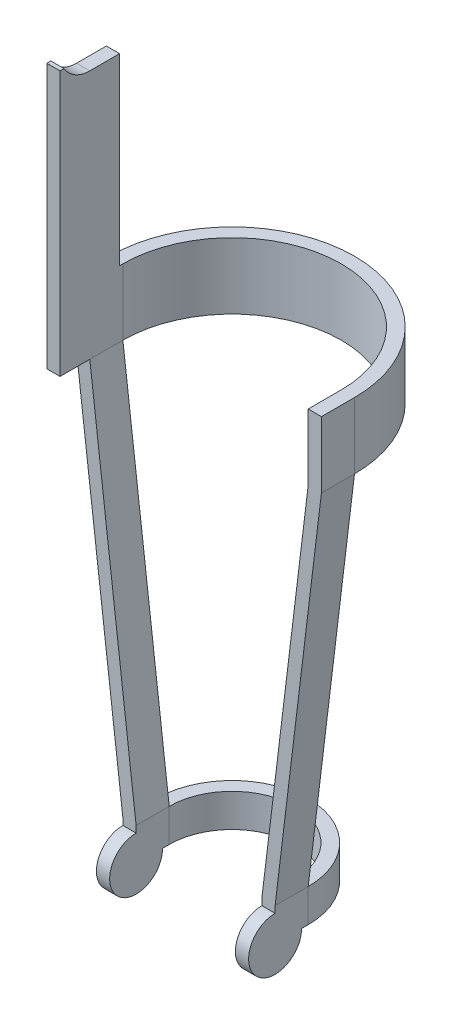
ISO-10303-21;
HEADER;
FILE_DESCRIPTION(('STEP AP214'),'2;1');
FILE_NAME('part.step','',(''),(''),'','','');
FILE_SCHEMA(('AUTOMOTIVE_DESIGN { 1 0 10303 214 1 1 1 1 }'));
ENDSEC;
DATA;
#1=APPLICATION_CONTEXT('core data for automotive mechanical design processes');
#2=APPLICATION_PROTOCOL_DEFINITION('international standard','automotive_design',2000,#1);
#3=PRODUCT_CONTEXT('',#1,'mechanical');
#4=PRODUCT('Part','Part','',(#3));
#5=PRODUCT_RELATED_PRODUCT_CATEGORY('part','',(#4));
#6=PRODUCT_DEFINITION_FORMATION('','',#4);
#7=PRODUCT_DEFINITION_CONTEXT('part definition',#1,'design');
#8=PRODUCT_DEFINITION('design','',#6,#7);
#9=PRODUCT_DEFINITION_SHAPE('','',#8);
#10=(LENGTH_UNIT() NAMED_UNIT(*) SI_UNIT(.MILLI.,.METRE.));
#11=(NAMED_UNIT(*) PLANE_ANGLE_UNIT() SI_UNIT($,.RADIAN.));
#12=(NAMED_UNIT(*) SI_UNIT($,.STERADIAN.) SOLID_ANGLE_UNIT());
#13=UNCERTAINTY_MEASURE_WITH_UNIT(LENGTH_MEASURE(1.E-05),#10,'distance_accuracy_value','');
#14=(GEOMETRIC_REPRESENTATION_CONTEXT(3) GLOBAL_UNCERTAINTY_ASSIGNED_CONTEXT((#13)) GLOBAL_UNIT_ASSIGNED_CONTEXT((#10,
#11,#12)) REPRESENTATION_CONTEXT('',''));
#15=CARTESIAN_POINT('',(0.,0.,0.));
#16=DIRECTION('',(0.,0.,1.));
#17=DIRECTION('',(1.,0.,0.));
#18=AXIS2_PLACEMENT_3D('',#15,#16,#17);
#19=CARTESIAN_POINT('',(-46.,20.,20.));
#20=DIRECTION('',(0.,0.,-1.));
#21=DIRECTION('',(-1.,0.,0.));
#22=AXIS2_PLACEMENT_3D('',#19,#20,#21);
#23=PLANE('',#22);
#24=DIRECTION('',(1.,0.,0.));
#25=VECTOR('',#24,1.);
#26=CARTESIAN_POINT('',(-46.,250.,20.));
#27=LINE('',#26,#25);
#28=CARTESIAN_POINT('',(-74.,250.,20.));
#29=VERTEX_POINT('',#28);
#30=CARTESIAN_POINT('',(-66.,250.,20.));
#31=VERTEX_POINT('',#30);
#32=EDGE_CURVE('E247',#29,#31,#27,.T.);
#33=ORIENTED_EDGE('',*,*,#32,.F.);
#34=DIRECTION('',(-0.120846923167835,0.992671154592933,0.));
#35=VECTOR('',#34,1.);
#36=CARTESIAN_POINT('',(-46.,20.,20.));
#37=LINE('',#36,#35);
#38=CARTESIAN_POINT('',(-46.,20.,20.));
#39=VERTEX_POINT('',#38);
#40=EDGE_CURVE('E371',#39,#29,#37,.T.);
#41=ORIENTED_EDGE('',*,*,#40,.F.);
#42=DIRECTION('',(0.,-1.,0.));
#43=VECTOR('',#42,1.);
#44=CARTESIAN_POINT('',(-46.,20.,20.));
#45=LINE('',#44,#43);
#46=CARTESIAN_POINT('',(-46.,16.,20.));
#47=VERTEX_POINT('',#46);
#48=EDGE_CURVE('E455',#39,#47,#45,.T.);
#49=ORIENTED_EDGE('',*,*,#48,.T.);
#50=DIRECTION('',(-1.,0.,0.));
#51=VECTOR('',#50,1.);
#52=CARTESIAN_POINT('',(-38.,16.,20.));
#53=LINE('',#52,#51);
#54=CARTESIAN_POINT('',(-38.,16.,20.));
#55=VERTEX_POINT('',#54);
#56=EDGE_CURVE('E451',#47,#55,#53,.F.);
#57=ORIENTED_EDGE('',*,*,#56,.T.);
#58=DIRECTION('',(0.,-1.,0.));
#59=VECTOR('',#58,1.);
#60=CARTESIAN_POINT('',(-38.,20.,20.));
#61=LINE('',#60,#59);
#62=CARTESIAN_POINT('',(-38.,20.,20.));
#63=VERTEX_POINT('',#62);
#64=EDGE_CURVE('E449',#63,#55,#61,.T.);
#65=ORIENTED_EDGE('',*,*,#64,.F.);
#66=DIRECTION('',(-0.120846923167835,0.992671154592933,0.));
#67=VECTOR('',#66,1.);
#68=CARTESIAN_POINT('',(-38.,20.,20.));
#69=LINE('',#68,#67);
#70=EDGE_CURVE('E348',#63,#31,#69,.T.);
#71=ORIENTED_EDGE('',*,*,#70,.T.);
#72=EDGE_LOOP('',(#33,#41,#49,#57,#65,#71));
#73=FACE_BOUND('',#72,.T.);
#74=ADVANCED_FACE('F40',(#73),#23,.F.);
#75=CARTESIAN_POINT('',(0.,20.,0.));
#76=DIRECTION('',(0.,-1.,0.));
#77=DIRECTION('',(0.,0.,-1.));
#78=AXIS2_PLACEMENT_3D('',#75,#76,#77);
#79=CYLINDRICAL_SURFACE('',#78,38.);
#80=CARTESIAN_POINT('',(0.,0.,0.));
#81=DIRECTION('',(0.,-1.,0.));
#82=DIRECTION('',(0.,0.,1.));
#83=AXIS2_PLACEMENT_3D('',#80,#81,#82);
#84=CIRCLE('',#83,38.);
#85=CARTESIAN_POINT('',(-38.,0.,0.));
#86=VERTEX_POINT('',#85);
#87=CARTESIAN_POINT('',(38.,0.,0.));
#88=VERTEX_POINT('',#87);
#89=EDGE_CURVE('E613',#86,#88,#84,.T.);
#90=ORIENTED_EDGE('',*,*,#89,.T.);
#91=DIRECTION('',(0.,-1.,0.));
#92=VECTOR('',#91,1.);
#93=CARTESIAN_POINT('',(38.,20.,0.));
#94=LINE('',#93,#92);
#95=CARTESIAN_POINT('',(38.,20.,0.));
#96=VERTEX_POINT('',#95);
#97=EDGE_CURVE('E482',#96,#88,#94,.T.);
#98=ORIENTED_EDGE('',*,*,#97,.F.);
#99=CARTESIAN_POINT('',(0.,20.,0.));
#100=DIRECTION('',(0.,-1.,0.));
#101=DIRECTION('',(0.,0.,1.));
#102=AXIS2_PLACEMENT_3D('',#99,#100,#101);
#103=CIRCLE('',#102,38.);
#104=CARTESIAN_POINT('',(-38.,20.,0.));
#105=VERTEX_POINT('',#104);
#106=EDGE_CURVE('E629',#105,#96,#103,.T.);
#107=ORIENTED_EDGE('',*,*,#106,.F.);
#108=DIRECTION('',(0.,-1.,0.));
#109=VECTOR('',#108,1.);
#110=CARTESIAN_POINT('',(-38.,20.,0.));
#111=LINE('',#110,#109);
#112=EDGE_CURVE('E456',#105,#86,#111,.T.);
#113=ORIENTED_EDGE('',*,*,#112,.T.);
#114=EDGE_LOOP('',(#90,#98,#107,#113));
#115=FACE_BOUND('',#114,.T.);
#116=ADVANCED_FACE('F42',(#115),#79,.F.);
#117=CARTESIAN_POINT('',(38.,20.,0.));
#118=DIRECTION('',(1.,0.,0.));
#119=DIRECTION('',(0.,0.,-1.));
#120=AXIS2_PLACEMENT_3D('',#117,#118,#119);
#121=PLANE('',#120);
#122=DIRECTION('',(0.,0.,1.));
#123=VECTOR('',#122,1.);
#124=CARTESIAN_POINT('',(38.,0.,0.));
#125=LINE('',#124,#123);
#126=CARTESIAN_POINT('',(38.,0.,4.));
#127=VERTEX_POINT('',#126);
#128=EDGE_CURVE('E606',#88,#127,#125,.T.);
#129=ORIENTED_EDGE('',*,*,#128,.T.);
#130=CARTESIAN_POINT('',(38.,0.,20.));
#131=DIRECTION('',(1.,0.,0.));
#132=DIRECTION('',(0.,0.,-1.));
#133=AXIS2_PLACEMENT_3D('',#130,#131,#132);
#134=CIRCLE('',#133,16.);
#135=CARTESIAN_POINT('',(38.,16.,20.));
#136=VERTEX_POINT('',#135);
#137=EDGE_CURVE('E313',#136,#127,#134,.T.);
#138=ORIENTED_EDGE('',*,*,#137,.F.);
#139=DIRECTION('',(0.,-1.,0.));
#140=VECTOR('',#139,1.);
#141=CARTESIAN_POINT('',(38.,20.,20.));
#142=LINE('',#141,#140);
#143=CARTESIAN_POINT('',(38.,20.,20.));
#144=VERTEX_POINT('',#143);
#145=EDGE_CURVE('E478',#144,#136,#142,.T.);
#146=ORIENTED_EDGE('',*,*,#145,.F.);
#147=DIRECTION('',(0.,0.,1.));
#148=VECTOR('',#147,1.);
#149=CARTESIAN_POINT('',(38.,20.,0.));
#150=LINE('',#149,#148);
#151=EDGE_CURVE('E634',#96,#144,#150,.T.);
#152=ORIENTED_EDGE('',*,*,#151,.F.);
#153=ORIENTED_EDGE('',*,*,#97,.T.);
#154=EDGE_LOOP('',(#129,#138,#146,#152,#153));
#155=FACE_BOUND('',#154,.T.);
#156=ADVANCED_FACE('F579',(#155),#121,.F.);
#157=CARTESIAN_POINT('',(46.,20.,20.));
#158=DIRECTION('',(0.,0.,-1.));
#159=DIRECTION('',(-1.,0.,0.));
#160=AXIS2_PLACEMENT_3D('',#157,#158,#159);
#161=PLANE('',#160);
#162=ORIENTED_EDGE('',*,*,#145,.T.);
#163=DIRECTION('',(1.,0.,0.));
#164=VECTOR('',#163,1.);
#165=CARTESIAN_POINT('',(38.,16.,20.));
#166=LINE('',#165,#164);
#167=CARTESIAN_POINT('',(46.,16.,20.));
#168=VERTEX_POINT('',#167);
#169=EDGE_CURVE('E668',#136,#168,#166,.T.);
#170=ORIENTED_EDGE('',*,*,#169,.T.);
#171=DIRECTION('',(0.,-1.,0.));
#172=VECTOR('',#171,1.);
#173=CARTESIAN_POINT('',(46.,20.,20.));
#174=LINE('',#173,#172);
#175=CARTESIAN_POINT('',(46.,20.,20.));
#176=VERTEX_POINT('',#175);
#177=EDGE_CURVE('E474',#176,#168,#174,.T.);
#178=ORIENTED_EDGE('',*,*,#177,.F.);
#179=DIRECTION('',(0.120846923167835,0.992671154592933,0.));
#180=VECTOR('',#179,1.);
#181=CARTESIAN_POINT('',(46.,20.,20.));
#182=LINE('',#181,#180);
#183=CARTESIAN_POINT('',(74.,250.,20.));
#184=VERTEX_POINT('',#183);
#185=EDGE_CURVE('E309',#176,#184,#182,.T.);
#186=ORIENTED_EDGE('',*,*,#185,.T.);
#187=DIRECTION('',(0.,1.,0.));
#188=VECTOR('',#187,1.);
#189=CARTESIAN_POINT('',(74.,250.,20.));
#190=LINE('',#189,#188);
#191=CARTESIAN_POINT('',(74.,290.,20.));
#192=VERTEX_POINT('',#191);
#193=EDGE_CURVE('E395',#184,#192,#190,.T.);
#194=ORIENTED_EDGE('',*,*,#193,.T.);
#195=DIRECTION('',(-1.,0.,0.));
#196=VECTOR('',#195,1.);
#197=CARTESIAN_POINT('',(74.,290.,20.));
#198=LINE('',#197,#196);
#199=CARTESIAN_POINT('',(66.,290.,20.));
#200=VERTEX_POINT('',#199);
#201=EDGE_CURVE('E401',#192,#200,#198,.T.);
#202=ORIENTED_EDGE('',*,*,#201,.T.);
#203=DIRECTION('',(0.,1.,0.));
#204=VECTOR('',#203,1.);
#205=CARTESIAN_POINT('',(66.,250.,20.));
#206=LINE('',#205,#204);
#207=CARTESIAN_POINT('',(66.,250.,20.));
#208=VERTEX_POINT('',#207);
#209=EDGE_CURVE('E406',#208,#200,#206,.T.);
#210=ORIENTED_EDGE('',*,*,#209,.F.);
#211=DIRECTION('',(0.120846923167835,0.992671154592933,0.));
#212=VECTOR('',#211,1.);
#213=CARTESIAN_POINT('',(38.,20.,20.));
#214=LINE('',#213,#212);
#215=EDGE_CURVE('E341',#144,#208,#214,.T.);
#216=ORIENTED_EDGE('',*,*,#215,.F.);
#217=EDGE_LOOP('',(#162,#170,#178,#186,#194,#202,#210,#216));
#218=FACE_BOUND('',#217,.T.);
#219=ADVANCED_FACE('F508',(#218),#161,.F.);
#220=CARTESIAN_POINT('',(46.,20.,0.));
#221=DIRECTION('',(-1.,0.,0.));
#222=DIRECTION('',(0.,0.,1.));
#223=AXIS2_PLACEMENT_3D('',#220,#221,#222);
#224=PLANE('',#223);
#225=ORIENTED_EDGE('',*,*,#177,.T.);
#226=CARTESIAN_POINT('',(46.,0.,20.));
#227=DIRECTION('',(1.,0.,0.));
#228=DIRECTION('',(0.,0.,-1.));
#229=AXIS2_PLACEMENT_3D('',#226,#227,#228);
#230=CIRCLE('',#229,16.);
#231=CARTESIAN_POINT('',(46.,0.,4.));
#232=VERTEX_POINT('',#231);
#233=EDGE_CURVE('E344',#168,#232,#230,.T.);
#234=ORIENTED_EDGE('',*,*,#233,.T.);
#235=DIRECTION('',(0.,0.,-1.));
#236=VECTOR('',#235,1.);
#237=CARTESIAN_POINT('',(46.,0.,0.));
#238=LINE('',#237,#236);
#239=CARTESIAN_POINT('',(46.,0.,0.));
#240=VERTEX_POINT('',#239);
#241=EDGE_CURVE('E612',#232,#240,#238,.T.);
#242=ORIENTED_EDGE('',*,*,#241,.T.);
#243=DIRECTION('',(0.,-1.,0.));
#244=VECTOR('',#243,1.);
#245=CARTESIAN_POINT('',(46.,20.,0.));
#246=LINE('',#245,#244);
#247=CARTESIAN_POINT('',(46.,20.,0.));
#248=VERTEX_POINT('',#247);
#249=EDGE_CURVE('E470',#248,#240,#246,.T.);
#250=ORIENTED_EDGE('',*,*,#249,.F.);
#251=DIRECTION('',(0.,0.,-1.));
#252=VECTOR('',#251,1.);
#253=CARTESIAN_POINT('',(46.,20.,0.));
#254=LINE('',#253,#252);
#255=EDGE_CURVE('E640',#176,#248,#254,.T.);
#256=ORIENTED_EDGE('',*,*,#255,.F.);
#257=EDGE_LOOP('',(#225,#234,#242,#250,#256));
#258=FACE_BOUND('',#257,.T.);
#259=ADVANCED_FACE('F592',(#258),#224,.F.);
#260=CARTESIAN_POINT('',(0.,20.,0.));
#261=DIRECTION('',(0.,-1.,0.));
#262=DIRECTION('',(0.,0.,-1.));
#263=AXIS2_PLACEMENT_3D('',#260,#261,#262);
#264=CYLINDRICAL_SURFACE('',#263,46.);
#265=CARTESIAN_POINT('',(0.,0.,0.));
#266=DIRECTION('',(0.,1.,0.));
#267=DIRECTION('',(0.,0.,1.));
#268=AXIS2_PLACEMENT_3D('',#265,#266,#267);
#269=CIRCLE('',#268,46.);
#270=CARTESIAN_POINT('',(-46.,0.,0.));
#271=VERTEX_POINT('',#270);
#272=EDGE_CURVE('E617',#240,#271,#269,.T.);
#273=ORIENTED_EDGE('',*,*,#272,.T.);
#274=DIRECTION('',(0.,-1.,0.));
#275=VECTOR('',#274,1.);
#276=CARTESIAN_POINT('',(-46.,20.,0.));
#277=LINE('',#276,#275);
#278=CARTESIAN_POINT('',(-46.,20.,0.));
#279=VERTEX_POINT('',#278);
#280=EDGE_CURVE('E460',#279,#271,#277,.T.);
#281=ORIENTED_EDGE('',*,*,#280,.F.);
#282=CARTESIAN_POINT('',(0.,20.,0.));
#283=DIRECTION('',(0.,1.,0.));
#284=DIRECTION('',(0.,0.,1.));
#285=AXIS2_PLACEMENT_3D('',#282,#283,#284);
#286=CIRCLE('',#285,46.);
#287=EDGE_CURVE('E648',#248,#279,#286,.T.);
#288=ORIENTED_EDGE('',*,*,#287,.F.);
#289=ORIENTED_EDGE('',*,*,#249,.T.);
#290=EDGE_LOOP('',(#273,#281,#288,#289));
#291=FACE_BOUND('',#290,.T.);
#292=ADVANCED_FACE('F588',(#291),#264,.T.);
#293=CARTESIAN_POINT('',(-46.,20.,0.));
#294=DIRECTION('',(1.,0.,0.));
#295=DIRECTION('',(0.,0.,-1.));
#296=AXIS2_PLACEMENT_3D('',#293,#294,#295);
#297=PLANE('',#296);
#298=DIRECTION('',(0.,0.,1.));
#299=VECTOR('',#298,1.);
#300=CARTESIAN_POINT('',(-46.,0.,0.));
#301=LINE('',#300,#299);
#302=CARTESIAN_POINT('',(-46.,0.,4.));
#303=VERTEX_POINT('',#302);
#304=EDGE_CURVE('E624',#271,#303,#301,.T.);
#305=ORIENTED_EDGE('',*,*,#304,.T.);
#306=CARTESIAN_POINT('',(-46.,0.,20.));
#307=DIRECTION('',(-1.,0.,0.));
#308=DIRECTION('',(0.,0.,1.));
#309=AXIS2_PLACEMENT_3D('',#306,#307,#308);
#310=CIRCLE('',#309,16.);
#311=EDGE_CURVE('E659',#303,#47,#310,.T.);
#312=ORIENTED_EDGE('',*,*,#311,.T.);
#313=ORIENTED_EDGE('',*,*,#48,.F.);
#314=DIRECTION('',(0.,0.,1.));
#315=VECTOR('',#314,1.);
#316=CARTESIAN_POINT('',(-46.,20.,0.));
#317=LINE('',#316,#315);
#318=EDGE_CURVE('E530',#279,#39,#317,.T.);
#319=ORIENTED_EDGE('',*,*,#318,.F.);
#320=ORIENTED_EDGE('',*,*,#280,.T.);
#321=EDGE_LOOP('',(#305,#312,#313,#319,#320));
#322=FACE_BOUND('',#321,.T.);
#323=ADVANCED_FACE('F585',(#322),#297,.F.);
#324=CARTESIAN_POINT('',(-38.,20.,0.));
#325=DIRECTION('',(-1.,0.,0.));
#326=DIRECTION('',(0.,0.,1.));
#327=AXIS2_PLACEMENT_3D('',#324,#325,#326);
#328=PLANE('',#327);
#329=ORIENTED_EDGE('',*,*,#64,.T.);
#330=CARTESIAN_POINT('',(-38.,0.,20.));
#331=DIRECTION('',(-1.,0.,0.));
#332=DIRECTION('',(0.,0.,1.));
#333=AXIS2_PLACEMENT_3D('',#330,#331,#332);
#334=CIRCLE('',#333,16.);
#335=CARTESIAN_POINT('',(-38.,0.,4.));
#336=VERTEX_POINT('',#335);
#337=EDGE_CURVE('E673',#336,#55,#334,.T.);
#338=ORIENTED_EDGE('',*,*,#337,.F.);
#339=DIRECTION('',(0.,0.,-1.));
#340=VECTOR('',#339,1.);
#341=CARTESIAN_POINT('',(-38.,0.,0.));
#342=LINE('',#341,#340);
#343=EDGE_CURVE('E627',#336,#86,#342,.T.);
#344=ORIENTED_EDGE('',*,*,#343,.T.);
#345=ORIENTED_EDGE('',*,*,#112,.F.);
#346=DIRECTION('',(0.,0.,-1.));
#347=VECTOR('',#346,1.);
#348=CARTESIAN_POINT('',(-38.,20.,0.));
#349=LINE('',#348,#347);
#350=EDGE_CURVE('E463',#63,#105,#349,.T.);
#351=ORIENTED_EDGE('',*,*,#350,.F.);
#352=EDGE_LOOP('',(#329,#338,#344,#345,#351));
#353=FACE_BOUND('',#352,.T.);
#354=ADVANCED_FACE('F583',(#353),#328,.F.);
#355=CARTESIAN_POINT('',(0.,20.,0.));
#356=DIRECTION('',(0.,1.,0.));
#357=DIRECTION('',(0.,0.,1.));
#358=AXIS2_PLACEMENT_3D('',#355,#356,#357);
#359=PLANE('',#358);
#360=DIRECTION('',(-1.,0.,0.));
#361=VECTOR('',#360,1.);
#362=CARTESIAN_POINT('',(-46.,20.,0.));
#363=LINE('',#362,#361);
#364=EDGE_CURVE('E353',#105,#279,#363,.T.);
#365=ORIENTED_EDGE('',*,*,#364,.F.);
#366=ORIENTED_EDGE('',*,*,#106,.T.);
#367=DIRECTION('',(-1.,0.,0.));
#368=VECTOR('',#367,1.);
#369=CARTESIAN_POINT('',(46.,20.,0.));
#370=LINE('',#369,#368);
#371=EDGE_CURVE('E305',#248,#96,#370,.T.);
#372=ORIENTED_EDGE('',*,*,#371,.F.);
#373=ORIENTED_EDGE('',*,*,#287,.T.);
#374=EDGE_LOOP('',(#365,#366,#372,#373));
#375=FACE_BOUND('',#374,.T.);
#376=ADVANCED_FACE('F687',(#375),#359,.T.);
#377=CARTESIAN_POINT('',(0.,0.,0.));
#378=DIRECTION('',(0.,1.,0.));
#379=DIRECTION('',(0.,0.,1.));
#380=AXIS2_PLACEMENT_3D('',#377,#378,#379);
#381=PLANE('',#380);
#382=ORIENTED_EDGE('',*,*,#241,.F.);
#383=DIRECTION('',(1.,0.,0.));
#384=VECTOR('',#383,1.);
#385=CARTESIAN_POINT('',(38.,0.,4.));
#386=LINE('',#385,#384);
#387=EDGE_CURVE('E49',#232,#127,#386,.F.);
#388=ORIENTED_EDGE('',*,*,#387,.T.);
#389=ORIENTED_EDGE('',*,*,#128,.F.);
#390=ORIENTED_EDGE('',*,*,#89,.F.);
#391=ORIENTED_EDGE('',*,*,#343,.F.);
#392=DIRECTION('',(-1.,0.,0.));
#393=VECTOR('',#392,1.);
#394=CARTESIAN_POINT('',(-38.,0.,4.));
#395=LINE('',#394,#393);
#396=EDGE_CURVE('E486',#336,#303,#395,.T.);
#397=ORIENTED_EDGE('',*,*,#396,.T.);
#398=ORIENTED_EDGE('',*,*,#304,.F.);
#399=ORIENTED_EDGE('',*,*,#272,.F.);
#400=EDGE_LOOP('',(#382,#388,#389,#390,#391,#397,#398,#399));
#401=FACE_BOUND('',#400,.T.);
#402=ADVANCED_FACE('F654',(#401),#381,.F.);
#403=CARTESIAN_POINT('',(-38.,0.,20.));
#404=DIRECTION('',(-1.,0.,0.));
#405=DIRECTION('',(0.,0.,1.));
#406=AXIS2_PLACEMENT_3D('',#403,#404,#405);
#407=CYLINDRICAL_SURFACE('',#406,16.);
#408=ORIENTED_EDGE('',*,*,#56,.F.);
#409=ORIENTED_EDGE('',*,*,#311,.F.);
#410=ORIENTED_EDGE('',*,*,#396,.F.);
#411=ORIENTED_EDGE('',*,*,#337,.T.);
#412=EDGE_LOOP('',(#408,#409,#410,#411));
#413=FACE_BOUND('',#412,.T.);
#414=ADVANCED_FACE('F677',(#413),#407,.T.);
#415=CARTESIAN_POINT('',(38.,0.,20.));
#416=DIRECTION('',(1.,0.,0.));
#417=DIRECTION('',(0.,0.,-1.));
#418=AXIS2_PLACEMENT_3D('',#415,#416,#417);
#419=CYLINDRICAL_SURFACE('',#418,16.);
#420=ORIENTED_EDGE('',*,*,#169,.F.);
#421=ORIENTED_EDGE('',*,*,#137,.T.);
#422=ORIENTED_EDGE('',*,*,#387,.F.);
#423=ORIENTED_EDGE('',*,*,#233,.F.);
#424=EDGE_LOOP('',(#420,#421,#422,#423));
#425=FACE_BOUND('',#424,.T.);
#426=ADVANCED_FACE('F569',(#425),#419,.T.);
#427=CARTESIAN_POINT('',(46.,20.,20.));
#428=DIRECTION('',(0.992671154592933,-0.120846923167835,0.));
#429=DIRECTION('',(0.120846923167835,0.992671154592933,0.));
#430=AXIS2_PLACEMENT_3D('',#427,#428,#429);
#431=PLANE('',#430);
#432=DIRECTION('',(0.120846923167835,0.992671154592933,0.));
#433=VECTOR('',#432,1.);
#434=CARTESIAN_POINT('',(46.,20.,0.));
#435=LINE('',#434,#433);
#436=CARTESIAN_POINT('',(74.,250.,0.));
#437=VERTEX_POINT('',#436);
#438=EDGE_CURVE('E322',#248,#437,#435,.T.);
#439=ORIENTED_EDGE('',*,*,#438,.T.);
#440=DIRECTION('',(0.,0.,-1.));
#441=VECTOR('',#440,1.);
#442=CARTESIAN_POINT('',(74.,250.,20.));
#443=LINE('',#442,#441);
#444=EDGE_CURVE('E325',#184,#437,#443,.T.);
#445=ORIENTED_EDGE('',*,*,#444,.F.);
#446=ORIENTED_EDGE('',*,*,#185,.F.);
#447=ORIENTED_EDGE('',*,*,#255,.T.);
#448=EDGE_LOOP('',(#439,#445,#446,#447));
#449=FACE_BOUND('',#448,.T.);
#450=ADVANCED_FACE('F558',(#449),#431,.T.);
#451=CARTESIAN_POINT('',(46.,20.,0.));
#452=DIRECTION('',(0.,0.,-1.));
#453=DIRECTION('',(-1.,0.,0.));
#454=AXIS2_PLACEMENT_3D('',#451,#452,#453);
#455=PLANE('',#454);
#456=DIRECTION('',(0.120846923167835,0.992671154592933,0.));
#457=VECTOR('',#456,1.);
#458=CARTESIAN_POINT('',(38.,20.,0.));
#459=LINE('',#458,#457);
#460=CARTESIAN_POINT('',(66.,250.,0.));
#461=VERTEX_POINT('',#460);
#462=EDGE_CURVE('E321',#96,#461,#459,.T.);
#463=ORIENTED_EDGE('',*,*,#462,.T.);
#464=DIRECTION('',(-1.,0.,0.));
#465=VECTOR('',#464,1.);
#466=CARTESIAN_POINT('',(74.,250.,0.));
#467=LINE('',#466,#465);
#468=EDGE_CURVE('E316',#437,#461,#467,.T.);
#469=ORIENTED_EDGE('',*,*,#468,.F.);
#470=ORIENTED_EDGE('',*,*,#438,.F.);
#471=ORIENTED_EDGE('',*,*,#371,.T.);
#472=EDGE_LOOP('',(#463,#469,#470,#471));
#473=FACE_BOUND('',#472,.T.);
#474=ADVANCED_FACE('F568',(#473),#455,.T.);
#475=CARTESIAN_POINT('',(38.,20.,20.));
#476=DIRECTION('',(-0.992671154592933,0.120846923167835,0.));
#477=DIRECTION('',(-0.120846923167835,-0.992671154592933,0.));
#478=AXIS2_PLACEMENT_3D('',#475,#476,#477);
#479=PLANE('',#478);
#480=ORIENTED_EDGE('',*,*,#215,.T.);
#481=DIRECTION('',(0.,0.,1.));
#482=VECTOR('',#481,1.);
#483=CARTESIAN_POINT('',(66.,250.,20.));
#484=LINE('',#483,#482);
#485=EDGE_CURVE('E345',#461,#208,#484,.T.);
#486=ORIENTED_EDGE('',*,*,#485,.F.);
#487=ORIENTED_EDGE('',*,*,#462,.F.);
#488=ORIENTED_EDGE('',*,*,#151,.T.);
#489=EDGE_LOOP('',(#480,#486,#487,#488));
#490=FACE_BOUND('',#489,.T.);
#491=ADVANCED_FACE('F685',(#490),#479,.T.);
#492=CARTESIAN_POINT('',(0.,290.,0.));
#493=DIRECTION('',(0.,1.,0.));
#494=DIRECTION('',(0.,0.,1.));
#495=AXIS2_PLACEMENT_3D('',#492,#493,#494);
#496=PLANE('',#495);
#497=DIRECTION('',(-1.,0.,0.));
#498=VECTOR('',#497,1.);
#499=CARTESIAN_POINT('',(0.,290.,2.));
#500=LINE('',#499,#498);
#501=CARTESIAN_POINT('',(-66.,290.,2.));
#502=VERTEX_POINT('',#501);
#503=CARTESIAN_POINT('',(-74.,290.,2.));
#504=VERTEX_POINT('',#503);
#505=EDGE_CURVE('E215',#502,#504,#500,.T.);
#506=ORIENTED_EDGE('',*,*,#505,.F.);
#507=DIRECTION('',(0.,0.,1.));
#508=VECTOR('',#507,1.);
#509=CARTESIAN_POINT('',(-66.,290.,0.));
#510=LINE('',#509,#508);
#511=CARTESIAN_POINT('',(-66.,290.,0.));
#512=VERTEX_POINT('',#511);
#513=EDGE_CURVE('E284',#512,#502,#510,.T.);
#514=ORIENTED_EDGE('',*,*,#513,.F.);
#515=CARTESIAN_POINT('',(0.,290.,0.));
#516=DIRECTION('',(0.,1.,0.));
#517=DIRECTION('',(0.,0.,-1.));
#518=AXIS2_PLACEMENT_3D('',#515,#516,#517);
#519=CIRCLE('',#518,66.);
#520=CARTESIAN_POINT('',(66.,290.,0.));
#521=VERTEX_POINT('',#520);
#522=EDGE_CURVE('E424',#521,#512,#519,.T.);
#523=ORIENTED_EDGE('',*,*,#522,.F.);
#524=DIRECTION('',(0.,0.,-1.));
#525=VECTOR('',#524,1.);
#526=CARTESIAN_POINT('',(66.,290.,0.));
#527=LINE('',#526,#525);
#528=EDGE_CURVE('E412',#200,#521,#527,.T.);
#529=ORIENTED_EDGE('',*,*,#528,.F.);
#530=ORIENTED_EDGE('',*,*,#201,.F.);
#531=DIRECTION('',(0.,0.,1.));
#532=VECTOR('',#531,1.);
#533=CARTESIAN_POINT('',(74.,290.,0.));
#534=LINE('',#533,#532);
#535=CARTESIAN_POINT('',(74.,290.,0.));
#536=VERTEX_POINT('',#535);
#537=EDGE_CURVE('E392',#536,#192,#534,.T.);
#538=ORIENTED_EDGE('',*,*,#537,.F.);
#539=CARTESIAN_POINT('',(0.,290.,0.));
#540=DIRECTION('',(0.,-1.,0.));
#541=DIRECTION('',(0.,0.,-1.));
#542=AXIS2_PLACEMENT_3D('',#539,#540,#541);
#543=CIRCLE('',#542,74.);
#544=CARTESIAN_POINT('',(-74.,290.,0.));
#545=VERTEX_POINT('',#544);
#546=EDGE_CURVE('E386',#545,#536,#543,.T.);
#547=ORIENTED_EDGE('',*,*,#546,.F.);
#548=DIRECTION('',(0.,0.,-1.));
#549=VECTOR('',#548,1.);
#550=CARTESIAN_POINT('',(-74.,290.,0.));
#551=LINE('',#550,#549);
#552=EDGE_CURVE('E377',#504,#545,#551,.T.);
#553=ORIENTED_EDGE('',*,*,#552,.F.);
#554=EDGE_LOOP('',(#506,#514,#523,#529,#530,#538,#547,#553));
#555=FACE_BOUND('',#554,.T.);
#556=ADVANCED_FACE('F512',(#555),#496,.T.);
#557=CARTESIAN_POINT('',(0.,250.,0.));
#558=DIRECTION('',(0.,1.,0.));
#559=DIRECTION('',(0.,0.,1.));
#560=AXIS2_PLACEMENT_3D('',#557,#558,#559);
#561=PLANE('',#560);
#562=CARTESIAN_POINT('',(0.,250.,0.));
#563=DIRECTION('',(0.,1.,0.));
#564=DIRECTION('',(0.,0.,-1.));
#565=AXIS2_PLACEMENT_3D('',#562,#563,#564);
#566=CIRCLE('',#565,66.);
#567=CARTESIAN_POINT('',(-66.,250.,0.));
#568=VERTEX_POINT('',#567);
#569=EDGE_CURVE('E417',#461,#568,#566,.T.);
#570=ORIENTED_EDGE('',*,*,#569,.T.);
#571=DIRECTION('',(-1.,0.,0.));
#572=VECTOR('',#571,1.);
#573=CARTESIAN_POINT('',(-74.,250.,0.));
#574=LINE('',#573,#572);
#575=CARTESIAN_POINT('',(-74.,250.,0.));
#576=VERTEX_POINT('',#575);
#577=EDGE_CURVE('E356',#568,#576,#574,.T.);
#578=ORIENTED_EDGE('',*,*,#577,.T.);
#579=CARTESIAN_POINT('',(0.,250.,0.));
#580=DIRECTION('',(0.,-1.,0.));
#581=DIRECTION('',(0.,0.,-1.));
#582=AXIS2_PLACEMENT_3D('',#579,#580,#581);
#583=CIRCLE('',#582,74.);
#584=EDGE_CURVE('E310',#576,#437,#583,.T.);
#585=ORIENTED_EDGE('',*,*,#584,.T.);
#586=ORIENTED_EDGE('',*,*,#468,.T.);
#587=EDGE_LOOP('',(#570,#578,#585,#586));
#588=FACE_BOUND('',#587,.T.);
#589=ADVANCED_FACE('F519',(#588),#561,.F.);
#590=CARTESIAN_POINT('',(-74.,250.,0.));
#591=DIRECTION('',(1.,0.,0.));
#592=DIRECTION('',(0.,0.,-1.));
#593=AXIS2_PLACEMENT_3D('',#590,#591,#592);
#594=PLANE('',#593);
#595=DIRECTION('',(0.,0.,-1.));
#596=VECTOR('',#595,1.);
#597=CARTESIAN_POINT('',(-74.,410.,2.));
#598=LINE('',#597,#596);
#599=CARTESIAN_POINT('',(-74.,410.,38.));
#600=VERTEX_POINT('',#599);
#601=CARTESIAN_POINT('',(-74.,410.,35.5884572681199));
#602=VERTEX_POINT('',#601);
#603=EDGE_CURVE('E244',#600,#602,#598,.T.);
#604=ORIENTED_EDGE('',*,*,#603,.T.);
#605=CARTESIAN_POINT('',(-74.,419.,20.));
#606=DIRECTION('',(-1.,0.,0.));
#607=DIRECTION('',(0.,0.,1.));
#608=AXIS2_PLACEMENT_3D('',#605,#606,#607);
#609=CIRCLE('',#608,18.);
#610=CARTESIAN_POINT('',(-74.,401.,20.));
#611=VERTEX_POINT('',#610);
#612=EDGE_CURVE('E55',#611,#602,#609,.T.);
#613=ORIENTED_EDGE('',*,*,#612,.F.);
#614=DIRECTION('',(0.,0.,1.));
#615=VECTOR('',#614,1.);
#616=CARTESIAN_POINT('',(-74.,401.,20.));
#617=LINE('',#616,#615);
#618=CARTESIAN_POINT('',(-74.,401.,2.));
#619=VERTEX_POINT('',#618);
#620=EDGE_CURVE('E200',#619,#611,#617,.T.);
#621=ORIENTED_EDGE('',*,*,#620,.F.);
#622=DIRECTION('',(0.,-1.,0.));
#623=VECTOR('',#622,1.);
#624=CARTESIAN_POINT('',(-74.,410.,2.));
#625=LINE('',#624,#623);
#626=EDGE_CURVE('E210',#619,#504,#625,.T.);
#627=ORIENTED_EDGE('',*,*,#626,.T.);
#628=ORIENTED_EDGE('',*,*,#552,.T.);
#629=DIRECTION('',(0.,1.,0.));
#630=VECTOR('',#629,1.);
#631=CARTESIAN_POINT('',(-74.,250.,0.));
#632=LINE('',#631,#630);
#633=EDGE_CURVE('E290',#576,#545,#632,.T.);
#634=ORIENTED_EDGE('',*,*,#633,.F.);
#635=DIRECTION('',(0.,0.,-1.));
#636=VECTOR('',#635,1.);
#637=CARTESIAN_POINT('',(-74.,250.,0.));
#638=LINE('',#637,#636);
#639=EDGE_CURVE('E297',#29,#576,#638,.T.);
#640=ORIENTED_EDGE('',*,*,#639,.F.);
#641=DIRECTION('',(0.,0.,-1.));
#642=VECTOR('',#641,1.);
#643=CARTESIAN_POINT('',(-74.,250.,2.));
#644=LINE('',#643,#642);
#645=CARTESIAN_POINT('',(-74.,250.,38.));
#646=VERTEX_POINT('',#645);
#647=EDGE_CURVE('E228',#646,#29,#644,.T.);
#648=ORIENTED_EDGE('',*,*,#647,.F.);
#649=DIRECTION('',(0.,-1.,0.));
#650=VECTOR('',#649,1.);
#651=CARTESIAN_POINT('',(-74.,410.,38.));
#652=LINE('',#651,#650);
#653=EDGE_CURVE('E245',#600,#646,#652,.T.);
#654=ORIENTED_EDGE('',*,*,#653,.F.);
#655=EDGE_LOOP('',(#604,#613,#621,#627,#628,#634,#640,#648,#654));
#656=FACE_BOUND('',#655,.T.);
#657=ADVANCED_FACE('F209',(#656),#594,.F.);
#658=CARTESIAN_POINT('',(-66.,250.,0.));
#659=DIRECTION('',(-1.,0.,0.));
#660=DIRECTION('',(0.,0.,1.));
#661=AXIS2_PLACEMENT_3D('',#658,#659,#660);
#662=PLANE('',#661);
#663=DIRECTION('',(0.,0.,1.));
#664=VECTOR('',#663,1.);
#665=CARTESIAN_POINT('',(-66.,401.,0.));
#666=LINE('',#665,#664);
#667=CARTESIAN_POINT('',(-66.,401.,2.));
#668=VERTEX_POINT('',#667);
#669=CARTESIAN_POINT('',(-66.,401.,20.));
#670=VERTEX_POINT('',#669);
#671=EDGE_CURVE('E202',#668,#670,#666,.T.);
#672=ORIENTED_EDGE('',*,*,#671,.T.);
#673=CARTESIAN_POINT('',(-66.,419.,20.));
#674=DIRECTION('',(-1.,0.,0.));
#675=DIRECTION('',(0.,0.,1.));
#676=AXIS2_PLACEMENT_3D('',#673,#674,#675);
#677=CIRCLE('',#676,18.);
#678=CARTESIAN_POINT('',(-66.,410.,35.5884572681199));
#679=VERTEX_POINT('',#678);
#680=EDGE_CURVE('E268',#670,#679,#677,.T.);
#681=ORIENTED_EDGE('',*,*,#680,.T.);
#682=DIRECTION('',(0.,0.,1.));
#683=VECTOR('',#682,1.);
#684=CARTESIAN_POINT('',(-66.,410.,2.));
#685=LINE('',#684,#683);
#686=CARTESIAN_POINT('',(-66.,410.,38.));
#687=VERTEX_POINT('',#686);
#688=EDGE_CURVE('E224',#679,#687,#685,.T.);
#689=ORIENTED_EDGE('',*,*,#688,.T.);
#690=DIRECTION('',(0.,-1.,0.));
#691=VECTOR('',#690,1.);
#692=CARTESIAN_POINT('',(-66.,410.,38.));
#693=LINE('',#692,#691);
#694=CARTESIAN_POINT('',(-66.,250.,38.));
#695=VERTEX_POINT('',#694);
#696=EDGE_CURVE('E221',#687,#695,#693,.T.);
#697=ORIENTED_EDGE('',*,*,#696,.T.);
#698=DIRECTION('',(0.,0.,1.));
#699=VECTOR('',#698,1.);
#700=CARTESIAN_POINT('',(-66.,250.,2.));
#701=LINE('',#700,#699);
#702=EDGE_CURVE('E233',#31,#695,#701,.T.);
#703=ORIENTED_EDGE('',*,*,#702,.F.);
#704=DIRECTION('',(0.,0.,1.));
#705=VECTOR('',#704,1.);
#706=CARTESIAN_POINT('',(-66.,250.,0.));
#707=LINE('',#706,#705);
#708=EDGE_CURVE('E294',#568,#31,#707,.T.);
#709=ORIENTED_EDGE('',*,*,#708,.F.);
#710=DIRECTION('',(0.,1.,0.));
#711=VECTOR('',#710,1.);
#712=CARTESIAN_POINT('',(-66.,250.,0.));
#713=LINE('',#712,#711);
#714=EDGE_CURVE('E286',#568,#512,#713,.T.);
#715=ORIENTED_EDGE('',*,*,#714,.T.);
#716=ORIENTED_EDGE('',*,*,#513,.T.);
#717=DIRECTION('',(0.,-1.,0.));
#718=VECTOR('',#717,1.);
#719=CARTESIAN_POINT('',(-66.,410.,2.));
#720=LINE('',#719,#718);
#721=EDGE_CURVE('E63',#668,#502,#720,.T.);
#722=ORIENTED_EDGE('',*,*,#721,.F.);
#723=EDGE_LOOP('',(#672,#681,#689,#697,#703,#709,#715,#716,#722));
#724=FACE_BOUND('',#723,.T.);
#725=ADVANCED_FACE('F254',(#724),#662,.F.);
#726=CARTESIAN_POINT('',(0.,250.,0.));
#727=DIRECTION('',(0.,1.,0.));
#728=DIRECTION('',(0.,0.,1.));
#729=AXIS2_PLACEMENT_3D('',#726,#727,#728);
#730=CYLINDRICAL_SURFACE('',#729,66.);
#731=ORIENTED_EDGE('',*,*,#522,.T.);
#732=ORIENTED_EDGE('',*,*,#714,.F.);
#733=ORIENTED_EDGE('',*,*,#569,.F.);
#734=DIRECTION('',(0.,1.,0.));
#735=VECTOR('',#734,1.);
#736=CARTESIAN_POINT('',(66.,250.,0.));
#737=LINE('',#736,#735);
#738=EDGE_CURVE('E420',#461,#521,#737,.T.);
#739=ORIENTED_EDGE('',*,*,#738,.T.);
#740=EDGE_LOOP('',(#731,#732,#733,#739));
#741=FACE_BOUND('',#740,.T.);
#742=ADVANCED_FACE('F516',(#741),#730,.F.);
#743=CARTESIAN_POINT('',(66.,250.,0.));
#744=DIRECTION('',(1.,0.,0.));
#745=DIRECTION('',(0.,0.,-1.));
#746=AXIS2_PLACEMENT_3D('',#743,#744,#745);
#747=PLANE('',#746);
#748=ORIENTED_EDGE('',*,*,#528,.T.);
#749=ORIENTED_EDGE('',*,*,#738,.F.);
#750=ORIENTED_EDGE('',*,*,#485,.T.);
#751=ORIENTED_EDGE('',*,*,#209,.T.);
#752=EDGE_LOOP('',(#748,#749,#750,#751));
#753=FACE_BOUND('',#752,.T.);
#754=ADVANCED_FACE('F502',(#753),#747,.F.);
#755=CARTESIAN_POINT('',(74.,250.,0.));
#756=DIRECTION('',(-1.,0.,0.));
#757=DIRECTION('',(0.,0.,1.));
#758=AXIS2_PLACEMENT_3D('',#755,#756,#757);
#759=PLANE('',#758);
#760=ORIENTED_EDGE('',*,*,#537,.T.);
#761=ORIENTED_EDGE('',*,*,#193,.F.);
#762=ORIENTED_EDGE('',*,*,#444,.T.);
#763=DIRECTION('',(0.,1.,0.));
#764=VECTOR('',#763,1.);
#765=CARTESIAN_POINT('',(74.,250.,0.));
#766=LINE('',#765,#764);
#767=EDGE_CURVE('E389',#437,#536,#766,.T.);
#768=ORIENTED_EDGE('',*,*,#767,.T.);
#769=EDGE_LOOP('',(#760,#761,#762,#768));
#770=FACE_BOUND('',#769,.T.);
#771=ADVANCED_FACE('F546',(#770),#759,.F.);
#772=CARTESIAN_POINT('',(0.,250.,0.));
#773=DIRECTION('',(0.,1.,0.));
#774=DIRECTION('',(0.,0.,1.));
#775=AXIS2_PLACEMENT_3D('',#772,#773,#774);
#776=CYLINDRICAL_SURFACE('',#775,74.);
#777=ORIENTED_EDGE('',*,*,#546,.T.);
#778=ORIENTED_EDGE('',*,*,#767,.F.);
#779=ORIENTED_EDGE('',*,*,#584,.F.);
#780=ORIENTED_EDGE('',*,*,#633,.T.);
#781=EDGE_LOOP('',(#777,#778,#779,#780));
#782=FACE_BOUND('',#781,.T.);
#783=ADVANCED_FACE('F548',(#782),#776,.T.);
#784=CARTESIAN_POINT('',(-38.,20.,20.));
#785=DIRECTION('',(0.992671154592933,0.120846923167835,0.));
#786=DIRECTION('',(-0.120846923167835,0.992671154592933,0.));
#787=AXIS2_PLACEMENT_3D('',#784,#785,#786);
#788=PLANE('',#787);
#789=DIRECTION('',(-0.120846923167835,0.992671154592933,0.));
#790=VECTOR('',#789,1.);
#791=CARTESIAN_POINT('',(-38.,20.,0.));
#792=LINE('',#791,#790);
#793=EDGE_CURVE('E352',#105,#568,#792,.T.);
#794=ORIENTED_EDGE('',*,*,#793,.T.);
#795=ORIENTED_EDGE('',*,*,#708,.T.);
#796=ORIENTED_EDGE('',*,*,#70,.F.);
#797=ORIENTED_EDGE('',*,*,#350,.T.);
#798=EDGE_LOOP('',(#794,#795,#796,#797));
#799=FACE_BOUND('',#798,.T.);
#800=ADVANCED_FACE('F440',(#799),#788,.T.);
#801=CARTESIAN_POINT('',(-46.,20.,0.));
#802=DIRECTION('',(0.,0.,-1.));
#803=DIRECTION('',(-1.,0.,0.));
#804=AXIS2_PLACEMENT_3D('',#801,#802,#803);
#805=PLANE('',#804);
#806=DIRECTION('',(-0.120846923167835,0.992671154592933,0.));
#807=VECTOR('',#806,1.);
#808=CARTESIAN_POINT('',(-46.,20.,0.));
#809=LINE('',#808,#807);
#810=EDGE_CURVE('E360',#279,#576,#809,.T.);
#811=ORIENTED_EDGE('',*,*,#810,.T.);
#812=ORIENTED_EDGE('',*,*,#577,.F.);
#813=ORIENTED_EDGE('',*,*,#793,.F.);
#814=ORIENTED_EDGE('',*,*,#364,.T.);
#815=EDGE_LOOP('',(#811,#812,#813,#814));
#816=FACE_BOUND('',#815,.T.);
#817=ADVANCED_FACE('F523',(#816),#805,.T.);
#818=CARTESIAN_POINT('',(-46.,20.,20.));
#819=DIRECTION('',(-0.992671154592933,-0.120846923167835,0.));
#820=DIRECTION('',(0.120846923167835,-0.992671154592933,0.));
#821=AXIS2_PLACEMENT_3D('',#818,#819,#820);
#822=PLANE('',#821);
#823=ORIENTED_EDGE('',*,*,#40,.T.);
#824=ORIENTED_EDGE('',*,*,#639,.T.);
#825=ORIENTED_EDGE('',*,*,#810,.F.);
#826=ORIENTED_EDGE('',*,*,#318,.T.);
#827=EDGE_LOOP('',(#823,#824,#825,#826));
#828=FACE_BOUND('',#827,.T.);
#829=ADVANCED_FACE('F528',(#828),#822,.T.);
#830=CARTESIAN_POINT('',(0.,250.,0.));
#831=DIRECTION('',(0.,1.,0.));
#832=DIRECTION('',(0.,0.,1.));
#833=AXIS2_PLACEMENT_3D('',#830,#831,#832);
#834=PLANE('',#833);
#835=ORIENTED_EDGE('',*,*,#647,.T.);
#836=ORIENTED_EDGE('',*,*,#32,.T.);
#837=ORIENTED_EDGE('',*,*,#702,.T.);
#838=DIRECTION('',(-1.,0.,0.));
#839=VECTOR('',#838,1.);
#840=CARTESIAN_POINT('',(-74.,250.,38.));
#841=LINE('',#840,#839);
#842=EDGE_CURVE('E240',#695,#646,#841,.T.);
#843=ORIENTED_EDGE('',*,*,#842,.T.);
#844=EDGE_LOOP('',(#835,#836,#837,#843));
#845=FACE_BOUND('',#844,.T.);
#846=ADVANCED_FACE('F262',(#845),#834,.F.);
#847=CARTESIAN_POINT('',(-74.,410.,38.));
#848=DIRECTION('',(0.,0.,1.));
#849=DIRECTION('',(1.,0.,0.));
#850=AXIS2_PLACEMENT_3D('',#847,#848,#849);
#851=PLANE('',#850);
#852=ORIENTED_EDGE('',*,*,#842,.F.);
#853=ORIENTED_EDGE('',*,*,#696,.F.);
#854=DIRECTION('',(-1.,0.,0.));
#855=VECTOR('',#854,1.);
#856=CARTESIAN_POINT('',(-74.,410.,38.));
#857=LINE('',#856,#855);
#858=EDGE_CURVE('E217',#687,#600,#857,.T.);
#859=ORIENTED_EDGE('',*,*,#858,.T.);
#860=ORIENTED_EDGE('',*,*,#653,.T.);
#861=EDGE_LOOP('',(#852,#853,#859,#860));
#862=FACE_BOUND('',#861,.T.);
#863=ADVANCED_FACE('F259',(#862),#851,.T.);
#864=CARTESIAN_POINT('',(-74.,410.,2.));
#865=DIRECTION('',(0.,0.,-1.));
#866=DIRECTION('',(-1.,0.,0.));
#867=AXIS2_PLACEMENT_3D('',#864,#865,#866);
#868=PLANE('',#867);
#869=DIRECTION('',(-1.,0.,0.));
#870=VECTOR('',#869,1.);
#871=CARTESIAN_POINT('',(86.,401.,2.));
#872=LINE('',#871,#870);
#873=EDGE_CURVE('E196',#668,#619,#872,.T.);
#874=ORIENTED_EDGE('',*,*,#873,.F.);
#875=ORIENTED_EDGE('',*,*,#721,.T.);
#876=ORIENTED_EDGE('',*,*,#505,.T.);
#877=ORIENTED_EDGE('',*,*,#626,.F.);
#878=EDGE_LOOP('',(#874,#875,#876,#877));
#879=FACE_BOUND('',#878,.T.);
#880=ADVANCED_FACE('F214',(#879),#868,.T.);
#881=CARTESIAN_POINT('',(0.,410.,0.));
#882=DIRECTION('',(0.,1.,0.));
#883=DIRECTION('',(0.,0.,1.));
#884=AXIS2_PLACEMENT_3D('',#881,#882,#883);
#885=PLANE('',#884);
#886=DIRECTION('',(-1.,0.,0.));
#887=VECTOR('',#886,1.);
#888=CARTESIAN_POINT('',(86.,410.,35.5884572681199));
#889=LINE('',#888,#887);
#890=EDGE_CURVE('E12',#602,#679,#889,.F.);
#891=ORIENTED_EDGE('',*,*,#890,.F.);
#892=ORIENTED_EDGE('',*,*,#603,.F.);
#893=ORIENTED_EDGE('',*,*,#858,.F.);
#894=ORIENTED_EDGE('',*,*,#688,.F.);
#895=EDGE_LOOP('',(#891,#892,#893,#894));
#896=FACE_BOUND('',#895,.T.);
#897=ADVANCED_FACE('F279',(#896),#885,.T.);
#898=CARTESIAN_POINT('',(86.,401.,20.));
#899=DIRECTION('',(0.,-1.,0.));
#900=DIRECTION('',(0.,0.,-1.));
#901=AXIS2_PLACEMENT_3D('',#898,#899,#900);
#902=PLANE('',#901);
#903=ORIENTED_EDGE('',*,*,#873,.T.);
#904=ORIENTED_EDGE('',*,*,#620,.T.);
#905=DIRECTION('',(-1.,0.,0.));
#906=VECTOR('',#905,1.);
#907=CARTESIAN_POINT('',(86.,401.,20.));
#908=LINE('',#907,#906);
#909=EDGE_CURVE('E205',#670,#611,#908,.T.);
#910=ORIENTED_EDGE('',*,*,#909,.F.);
#911=ORIENTED_EDGE('',*,*,#671,.F.);
#912=EDGE_LOOP('',(#903,#904,#910,#911));
#913=FACE_BOUND('',#912,.T.);
#914=ADVANCED_FACE('F198',(#913),#902,.F.);
#915=CARTESIAN_POINT('',(86.,419.,20.));
#916=DIRECTION('',(-1.,0.,0.));
#917=DIRECTION('',(0.,0.,1.));
#918=AXIS2_PLACEMENT_3D('',#915,#916,#917);
#919=CYLINDRICAL_SURFACE('',#918,18.);
#920=ORIENTED_EDGE('',*,*,#909,.T.);
#921=ORIENTED_EDGE('',*,*,#612,.T.);
#922=ORIENTED_EDGE('',*,*,#890,.T.);
#923=ORIENTED_EDGE('',*,*,#680,.F.);
#924=EDGE_LOOP('',(#920,#921,#922,#923));
#925=FACE_BOUND('',#924,.T.);
#926=ADVANCED_FACE('F280',(#925),#919,.F.);
#927=CLOSED_SHELL('',(#74,#116,#156,#219,#259,#292,#323,#354,#376,#402,#414,#426,#450,#474,#491,
#556,#589,#657,#725,#742,#754,#771,#783,#800,#817,#829,#846,#863,#880,#897,#914,#926));
#928=MANIFOLD_SOLID_BREP('B2',#927);
#929=ADVANCED_BREP_SHAPE_REPRESENTATION('',(#18,#928),#14);
#930=SHAPE_DEFINITION_REPRESENTATION(#9,#929);
ENDSEC;
END-ISO-10303-21;
